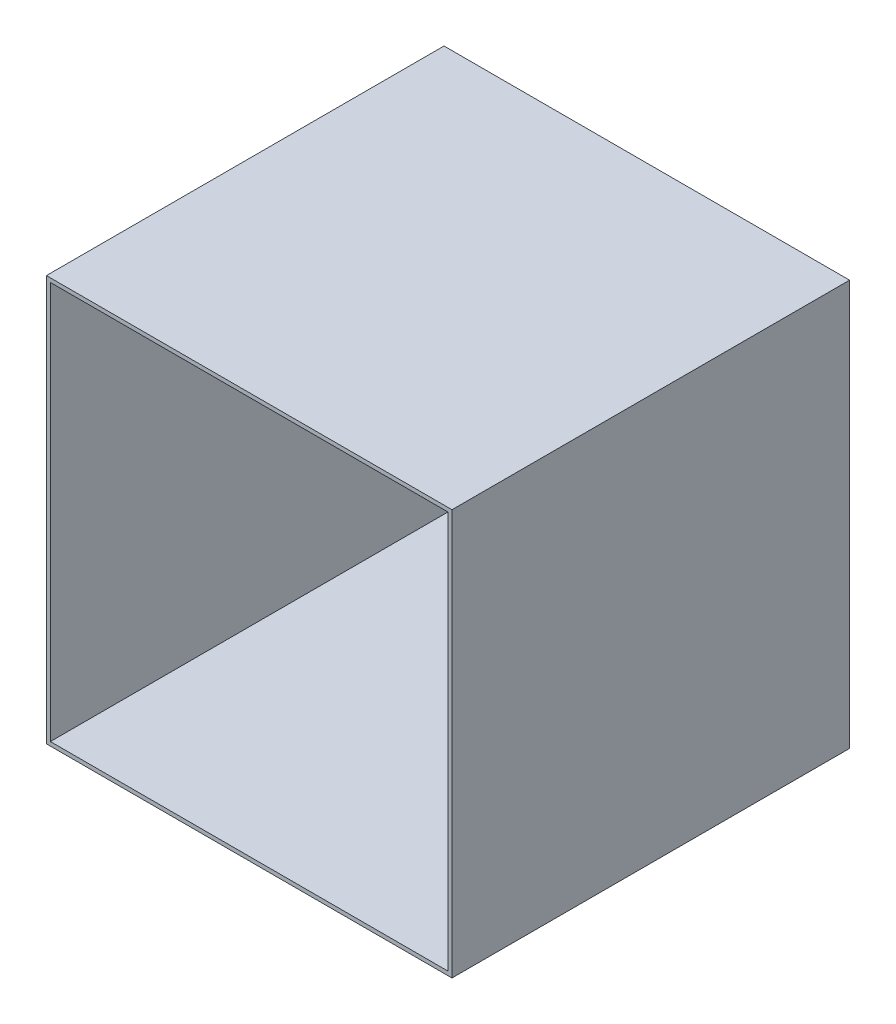
ISO-10303-21;
HEADER;
FILE_DESCRIPTION(('STEP AP214'),'2;1');
FILE_NAME('part.step','',(''),(''),'','','');
FILE_SCHEMA(('AUTOMOTIVE_DESIGN { 1 0 10303 214 1 1 1 1 }'));
ENDSEC;
DATA;
#1=APPLICATION_CONTEXT('core data for automotive mechanical design processes');
#2=APPLICATION_PROTOCOL_DEFINITION('international standard','automotive_design',2000,#1);
#3=PRODUCT_CONTEXT('',#1,'mechanical');
#4=PRODUCT('Part','Part','',(#3));
#5=PRODUCT_RELATED_PRODUCT_CATEGORY('part','',(#4));
#6=PRODUCT_DEFINITION_FORMATION('','',#4);
#7=PRODUCT_DEFINITION_CONTEXT('part definition',#1,'design');
#8=PRODUCT_DEFINITION('design','',#6,#7);
#9=PRODUCT_DEFINITION_SHAPE('','',#8);
#10=(LENGTH_UNIT() NAMED_UNIT(*) SI_UNIT(.MILLI.,.METRE.));
#11=(NAMED_UNIT(*) PLANE_ANGLE_UNIT() SI_UNIT($,.RADIAN.));
#12=(NAMED_UNIT(*) SI_UNIT($,.STERADIAN.) SOLID_ANGLE_UNIT());
#13=UNCERTAINTY_MEASURE_WITH_UNIT(LENGTH_MEASURE(1.E-05),#10,'distance_accuracy_value','');
#14=(GEOMETRIC_REPRESENTATION_CONTEXT(3) GLOBAL_UNCERTAINTY_ASSIGNED_CONTEXT((#13)) GLOBAL_UNIT_ASSIGNED_CONTEXT((#10,
#11,#12)) REPRESENTATION_CONTEXT('',''));
#15=CARTESIAN_POINT('',(0.,0.,0.));
#16=DIRECTION('',(0.,0.,1.));
#17=DIRECTION('',(1.,0.,0.));
#18=AXIS2_PLACEMENT_3D('',#15,#16,#17);
#19=CARTESIAN_POINT('',(0.,0.,200.));
#20=DIRECTION('',(0.,0.,1.));
#21=DIRECTION('',(1.,0.,0.));
#22=AXIS2_PLACEMENT_3D('',#19,#20,#21);
#23=PLANE('',#22);
#24=DIRECTION('',(0.,-1.,0.));
#25=VECTOR('',#24,1.);
#26=CARTESIAN_POINT('',(-106.156513972017,121.178249184607,200.));
#27=LINE('',#26,#25);
#28=CARTESIAN_POINT('',(-106.156513972017,123.178249184607,200.));
#29=VERTEX_POINT('',#28);
#30=CARTESIAN_POINT('',(-106.156513972017,-80.8217508153929,200.));
#31=VERTEX_POINT('',#30);
#32=EDGE_CURVE('E160',#29,#31,#27,.T.);
#33=ORIENTED_EDGE('',*,*,#32,.T.);
#34=DIRECTION('',(1.,0.,0.));
#35=VECTOR('',#34,1.);
#36=CARTESIAN_POINT('',(-104.156513972017,-80.8217508153929,200.));
#37=LINE('',#36,#35);
#38=CARTESIAN_POINT('',(97.8434860279833,-80.8217508153929,200.));
#39=VERTEX_POINT('',#38);
#40=EDGE_CURVE('E163',#31,#39,#37,.T.);
#41=ORIENTED_EDGE('',*,*,#40,.T.);
#42=DIRECTION('',(0.,1.,0.));
#43=VECTOR('',#42,1.);
#44=CARTESIAN_POINT('',(97.8434860279833,121.178249184607,200.));
#45=LINE('',#44,#43);
#46=CARTESIAN_POINT('',(97.8434860279833,123.178249184607,200.));
#47=VERTEX_POINT('',#46);
#48=EDGE_CURVE('E166',#39,#47,#45,.T.);
#49=ORIENTED_EDGE('',*,*,#48,.T.);
#50=DIRECTION('',(-1.,0.,0.));
#51=VECTOR('',#50,1.);
#52=CARTESIAN_POINT('',(-104.156513972017,123.178249184607,200.));
#53=LINE('',#52,#51);
#54=EDGE_CURVE('E168',#47,#29,#53,.T.);
#55=ORIENTED_EDGE('',*,*,#54,.T.);
#56=EDGE_LOOP('',(#33,#41,#49,#55));
#57=FACE_BOUND('',#56,.T.);
#58=DIRECTION('',(1.,0.,0.));
#59=VECTOR('',#58,1.);
#60=CARTESIAN_POINT('',(-104.156513972017,-78.8217508153929,200.));
#61=LINE('',#60,#59);
#62=CARTESIAN_POINT('',(-104.156513972017,-78.8217508153929,200.));
#63=VERTEX_POINT('',#62);
#64=CARTESIAN_POINT('',(95.8434860279833,-78.8217508153929,200.));
#65=VERTEX_POINT('',#64);
#66=EDGE_CURVE('E132',#63,#65,#61,.T.);
#67=ORIENTED_EDGE('',*,*,#66,.F.);
#68=DIRECTION('',(0.,-1.,0.));
#69=VECTOR('',#68,1.);
#70=CARTESIAN_POINT('',(-104.156513972017,121.178249184607,200.));
#71=LINE('',#70,#69);
#72=CARTESIAN_POINT('',(-104.156513972017,121.178249184607,200.));
#73=VERTEX_POINT('',#72);
#74=EDGE_CURVE('E124',#73,#63,#71,.T.);
#75=ORIENTED_EDGE('',*,*,#74,.F.);
#76=DIRECTION('',(-1.,0.,0.));
#77=VECTOR('',#76,1.);
#78=CARTESIAN_POINT('',(-104.156513972017,121.178249184607,200.));
#79=LINE('',#78,#77);
#80=CARTESIAN_POINT('',(95.8434860279833,121.178249184607,200.));
#81=VERTEX_POINT('',#80);
#82=EDGE_CURVE('E146',#81,#73,#79,.T.);
#83=ORIENTED_EDGE('',*,*,#82,.F.);
#84=DIRECTION('',(0.,1.,0.));
#85=VECTOR('',#84,1.);
#86=CARTESIAN_POINT('',(95.8434860279833,121.178249184607,200.));
#87=LINE('',#86,#85);
#88=EDGE_CURVE('E144',#65,#81,#87,.T.);
#89=ORIENTED_EDGE('',*,*,#88,.F.);
#90=EDGE_LOOP('',(#67,#75,#83,#89));
#91=FACE_BOUND('',#90,.T.);
#92=ADVANCED_FACE('F59',(#57,#91),#23,.T.);
#93=CARTESIAN_POINT('',(0.,0.,0.));
#94=DIRECTION('',(0.,0.,1.));
#95=DIRECTION('',(1.,0.,0.));
#96=AXIS2_PLACEMENT_3D('',#93,#94,#95);
#97=PLANE('',#96);
#98=DIRECTION('',(0.,-1.,0.));
#99=VECTOR('',#98,1.);
#100=CARTESIAN_POINT('',(-106.156513972017,121.178249184607,0.));
#101=LINE('',#100,#99);
#102=CARTESIAN_POINT('',(-106.156513972017,123.178249184607,0.));
#103=VERTEX_POINT('',#102);
#104=CARTESIAN_POINT('',(-106.156513972017,-80.8217508153929,0.));
#105=VERTEX_POINT('',#104);
#106=EDGE_CURVE('E140',#103,#105,#101,.T.);
#107=ORIENTED_EDGE('',*,*,#106,.F.);
#108=DIRECTION('',(-1.,0.,0.));
#109=VECTOR('',#108,1.);
#110=CARTESIAN_POINT('',(-104.156513972017,123.178249184607,0.));
#111=LINE('',#110,#109);
#112=CARTESIAN_POINT('',(97.8434860279833,123.178249184607,0.));
#113=VERTEX_POINT('',#112);
#114=EDGE_CURVE('E164',#113,#103,#111,.T.);
#115=ORIENTED_EDGE('',*,*,#114,.F.);
#116=DIRECTION('',(0.,1.,0.));
#117=VECTOR('',#116,1.);
#118=CARTESIAN_POINT('',(97.8434860279833,121.178249184607,0.));
#119=LINE('',#118,#117);
#120=CARTESIAN_POINT('',(97.8434860279833,-80.8217508153929,0.));
#121=VERTEX_POINT('',#120);
#122=EDGE_CURVE('E175',#121,#113,#119,.T.);
#123=ORIENTED_EDGE('',*,*,#122,.F.);
#124=DIRECTION('',(1.,0.,0.));
#125=VECTOR('',#124,1.);
#126=CARTESIAN_POINT('',(-104.156513972017,-80.8217508153929,0.));
#127=LINE('',#126,#125);
#128=EDGE_CURVE('E173',#105,#121,#127,.T.);
#129=ORIENTED_EDGE('',*,*,#128,.F.);
#130=EDGE_LOOP('',(#107,#115,#123,#129));
#131=FACE_BOUND('',#130,.T.);
#132=DIRECTION('',(0.,-1.,0.));
#133=VECTOR('',#132,1.);
#134=CARTESIAN_POINT('',(-104.156513972017,121.178249184607,0.));
#135=LINE('',#134,#133);
#136=CARTESIAN_POINT('',(-104.156513972017,121.178249184607,0.));
#137=VERTEX_POINT('',#136);
#138=CARTESIAN_POINT('',(-104.156513972017,-78.8217508153929,0.));
#139=VERTEX_POINT('',#138);
#140=EDGE_CURVE('E82',#137,#139,#135,.T.);
#141=ORIENTED_EDGE('',*,*,#140,.T.);
#142=DIRECTION('',(1.,0.,0.));
#143=VECTOR('',#142,1.);
#144=CARTESIAN_POINT('',(-104.156513972017,-78.8217508153929,0.));
#145=LINE('',#144,#143);
#146=CARTESIAN_POINT('',(95.8434860279833,-78.8217508153929,0.));
#147=VERTEX_POINT('',#146);
#148=EDGE_CURVE('E139',#139,#147,#145,.T.);
#149=ORIENTED_EDGE('',*,*,#148,.T.);
#150=DIRECTION('',(0.,1.,0.));
#151=VECTOR('',#150,1.);
#152=CARTESIAN_POINT('',(95.8434860279833,121.178249184607,0.));
#153=LINE('',#152,#151);
#154=CARTESIAN_POINT('',(95.8434860279833,121.178249184607,0.));
#155=VERTEX_POINT('',#154);
#156=EDGE_CURVE('E152',#147,#155,#153,.T.);
#157=ORIENTED_EDGE('',*,*,#156,.T.);
#158=DIRECTION('',(-1.,0.,0.));
#159=VECTOR('',#158,1.);
#160=CARTESIAN_POINT('',(-104.156513972017,121.178249184607,0.));
#161=LINE('',#160,#159);
#162=EDGE_CURVE('E133',#155,#137,#161,.T.);
#163=ORIENTED_EDGE('',*,*,#162,.T.);
#164=EDGE_LOOP('',(#141,#149,#157,#163));
#165=FACE_BOUND('',#164,.T.);
#166=ADVANCED_FACE('F193',(#131,#165),#97,.F.);
#167=CARTESIAN_POINT('',(-106.156513972017,121.178249184607,200.));
#168=DIRECTION('',(1.,0.,0.));
#169=DIRECTION('',(0.,1.,0.));
#170=AXIS2_PLACEMENT_3D('',#167,#168,#169);
#171=PLANE('',#170);
#172=ORIENTED_EDGE('',*,*,#106,.T.);
#173=DIRECTION('',(0.,0.,-1.));
#174=VECTOR('',#173,1.);
#175=CARTESIAN_POINT('',(-106.156513972017,-80.8217508153929,200.));
#176=LINE('',#175,#174);
#177=EDGE_CURVE('E12',#31,#105,#176,.T.);
#178=ORIENTED_EDGE('',*,*,#177,.F.);
#179=ORIENTED_EDGE('',*,*,#32,.F.);
#180=DIRECTION('',(0.,0.,-1.));
#181=VECTOR('',#180,1.);
#182=CARTESIAN_POINT('',(-106.156513972017,123.178249184607,200.));
#183=LINE('',#182,#181);
#184=EDGE_CURVE('E170',#29,#103,#183,.T.);
#185=ORIENTED_EDGE('',*,*,#184,.T.);
#186=EDGE_LOOP('',(#172,#178,#179,#185));
#187=FACE_BOUND('',#186,.T.);
#188=ADVANCED_FACE('F61',(#187),#171,.F.);
#189=CARTESIAN_POINT('',(-104.156513972017,-80.8217508153929,200.));
#190=DIRECTION('',(0.,1.,0.));
#191=DIRECTION('',(0.,0.,1.));
#192=AXIS2_PLACEMENT_3D('',#189,#190,#191);
#193=PLANE('',#192);
#194=ORIENTED_EDGE('',*,*,#128,.T.);
#195=DIRECTION('',(0.,0.,-1.));
#196=VECTOR('',#195,1.);
#197=CARTESIAN_POINT('',(97.8434860279833,-80.8217508153929,200.));
#198=LINE('',#197,#196);
#199=EDGE_CURVE('E67',#39,#121,#198,.T.);
#200=ORIENTED_EDGE('',*,*,#199,.F.);
#201=ORIENTED_EDGE('',*,*,#40,.F.);
#202=ORIENTED_EDGE('',*,*,#177,.T.);
#203=EDGE_LOOP('',(#194,#200,#201,#202));
#204=FACE_BOUND('',#203,.T.);
#205=ADVANCED_FACE('F203',(#204),#193,.F.);
#206=CARTESIAN_POINT('',(97.8434860279833,121.178249184607,200.));
#207=DIRECTION('',(-1.,0.,0.));
#208=DIRECTION('',(0.,-1.,0.));
#209=AXIS2_PLACEMENT_3D('',#206,#207,#208);
#210=PLANE('',#209);
#211=ORIENTED_EDGE('',*,*,#122,.T.);
#212=DIRECTION('',(0.,0.,-1.));
#213=VECTOR('',#212,1.);
#214=CARTESIAN_POINT('',(97.8434860279833,123.178249184607,200.));
#215=LINE('',#214,#213);
#216=EDGE_CURVE('E180',#47,#113,#215,.T.);
#217=ORIENTED_EDGE('',*,*,#216,.F.);
#218=ORIENTED_EDGE('',*,*,#48,.F.);
#219=ORIENTED_EDGE('',*,*,#199,.T.);
#220=EDGE_LOOP('',(#211,#217,#218,#219));
#221=FACE_BOUND('',#220,.T.);
#222=ADVANCED_FACE('F187',(#221),#210,.F.);
#223=CARTESIAN_POINT('',(-104.156513972017,123.178249184607,200.));
#224=DIRECTION('',(0.,-1.,0.));
#225=DIRECTION('',(0.,0.,-1.));
#226=AXIS2_PLACEMENT_3D('',#223,#224,#225);
#227=PLANE('',#226);
#228=ORIENTED_EDGE('',*,*,#114,.T.);
#229=ORIENTED_EDGE('',*,*,#184,.F.);
#230=ORIENTED_EDGE('',*,*,#54,.F.);
#231=ORIENTED_EDGE('',*,*,#216,.T.);
#232=EDGE_LOOP('',(#228,#229,#230,#231));
#233=FACE_BOUND('',#232,.T.);
#234=ADVANCED_FACE('F197',(#233),#227,.F.);
#235=CARTESIAN_POINT('',(-104.156513972017,121.178249184607,200.));
#236=DIRECTION('',(1.,0.,0.));
#237=DIRECTION('',(0.,1.,0.));
#238=AXIS2_PLACEMENT_3D('',#235,#236,#237);
#239=PLANE('',#238);
#240=ORIENTED_EDGE('',*,*,#140,.F.);
#241=DIRECTION('',(0.,0.,-1.));
#242=VECTOR('',#241,1.);
#243=CARTESIAN_POINT('',(-104.156513972017,121.178249184607,200.));
#244=LINE('',#243,#242);
#245=EDGE_CURVE('E128',#73,#137,#244,.T.);
#246=ORIENTED_EDGE('',*,*,#245,.F.);
#247=ORIENTED_EDGE('',*,*,#74,.T.);
#248=DIRECTION('',(0.,0.,-1.));
#249=VECTOR('',#248,1.);
#250=CARTESIAN_POINT('',(-104.156513972017,-78.8217508153929,200.));
#251=LINE('',#250,#249);
#252=EDGE_CURVE('E127',#63,#139,#251,.T.);
#253=ORIENTED_EDGE('',*,*,#252,.T.);
#254=EDGE_LOOP('',(#240,#246,#247,#253));
#255=FACE_BOUND('',#254,.T.);
#256=ADVANCED_FACE('F126',(#255),#239,.T.);
#257=CARTESIAN_POINT('',(-104.156513972017,-78.8217508153929,200.));
#258=DIRECTION('',(0.,1.,0.));
#259=DIRECTION('',(0.,0.,1.));
#260=AXIS2_PLACEMENT_3D('',#257,#258,#259);
#261=PLANE('',#260);
#262=ORIENTED_EDGE('',*,*,#148,.F.);
#263=ORIENTED_EDGE('',*,*,#252,.F.);
#264=ORIENTED_EDGE('',*,*,#66,.T.);
#265=DIRECTION('',(0.,0.,-1.));
#266=VECTOR('',#265,1.);
#267=CARTESIAN_POINT('',(95.8434860279833,-78.8217508153929,200.));
#268=LINE('',#267,#266);
#269=EDGE_CURVE('E141',#65,#147,#268,.T.);
#270=ORIENTED_EDGE('',*,*,#269,.T.);
#271=EDGE_LOOP('',(#262,#263,#264,#270));
#272=FACE_BOUND('',#271,.T.);
#273=ADVANCED_FACE('F136',(#272),#261,.T.);
#274=CARTESIAN_POINT('',(95.8434860279833,121.178249184607,200.));
#275=DIRECTION('',(-1.,0.,0.));
#276=DIRECTION('',(0.,-1.,0.));
#277=AXIS2_PLACEMENT_3D('',#274,#275,#276);
#278=PLANE('',#277);
#279=ORIENTED_EDGE('',*,*,#156,.F.);
#280=ORIENTED_EDGE('',*,*,#269,.F.);
#281=ORIENTED_EDGE('',*,*,#88,.T.);
#282=DIRECTION('',(0.,0.,-1.));
#283=VECTOR('',#282,1.);
#284=CARTESIAN_POINT('',(95.8434860279833,121.178249184607,200.));
#285=LINE('',#284,#283);
#286=EDGE_CURVE('E74',#81,#155,#285,.T.);
#287=ORIENTED_EDGE('',*,*,#286,.T.);
#288=EDGE_LOOP('',(#279,#280,#281,#287));
#289=FACE_BOUND('',#288,.T.);
#290=ADVANCED_FACE('F226',(#289),#278,.T.);
#291=CARTESIAN_POINT('',(-104.156513972017,121.178249184607,200.));
#292=DIRECTION('',(0.,-1.,0.));
#293=DIRECTION('',(0.,0.,-1.));
#294=AXIS2_PLACEMENT_3D('',#291,#292,#293);
#295=PLANE('',#294);
#296=ORIENTED_EDGE('',*,*,#162,.F.);
#297=ORIENTED_EDGE('',*,*,#286,.F.);
#298=ORIENTED_EDGE('',*,*,#82,.T.);
#299=ORIENTED_EDGE('',*,*,#245,.T.);
#300=EDGE_LOOP('',(#296,#297,#298,#299));
#301=FACE_BOUND('',#300,.T.);
#302=ADVANCED_FACE('F230',(#301),#295,.T.);
#303=CLOSED_SHELL('',(#92,#166,#188,#205,#222,#234,#256,#273,#290,#302));
#304=MANIFOLD_SOLID_BREP('B2',#303);
#305=ADVANCED_BREP_SHAPE_REPRESENTATION('',(#18,#304),#14);
#306=SHAPE_DEFINITION_REPRESENTATION(#9,#305);
ENDSEC;
END-ISO-10303-21;
